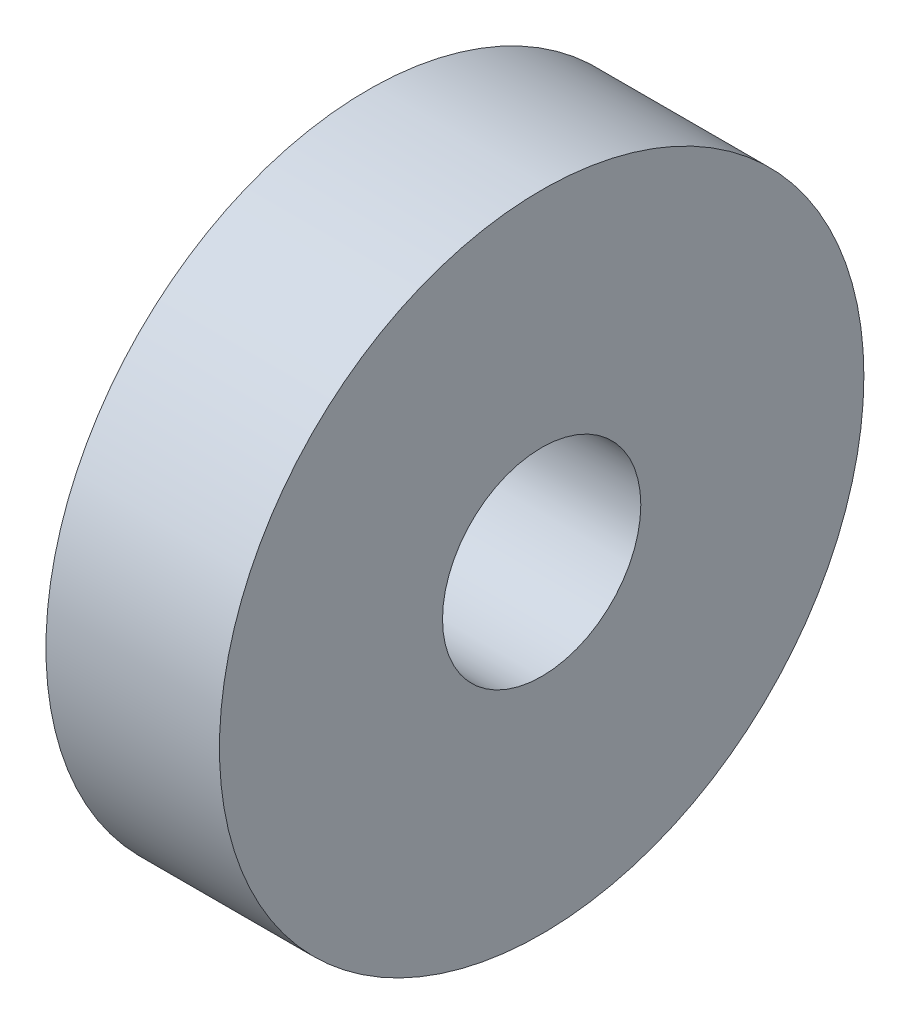
ISO-10303-21;
HEADER;
FILE_DESCRIPTION(('STEP AP214'),'2;1');
FILE_NAME('part.step','',(''),(''),'','','');
FILE_SCHEMA(('AUTOMOTIVE_DESIGN { 1 0 10303 214 1 1 1 1 }'));
ENDSEC;
DATA;
#1=APPLICATION_CONTEXT('core data for automotive mechanical design processes');
#2=APPLICATION_PROTOCOL_DEFINITION('international standard','automotive_design',2000,#1);
#3=PRODUCT_CONTEXT('',#1,'mechanical');
#4=PRODUCT('Part','Part','',(#3));
#5=PRODUCT_RELATED_PRODUCT_CATEGORY('part','',(#4));
#6=PRODUCT_DEFINITION_FORMATION('','',#4);
#7=PRODUCT_DEFINITION_CONTEXT('part definition',#1,'design');
#8=PRODUCT_DEFINITION('design','',#6,#7);
#9=PRODUCT_DEFINITION_SHAPE('','',#8);
#10=(LENGTH_UNIT() NAMED_UNIT(*) SI_UNIT(.MILLI.,.METRE.));
#11=(NAMED_UNIT(*) PLANE_ANGLE_UNIT() SI_UNIT($,.RADIAN.));
#12=(NAMED_UNIT(*) SI_UNIT($,.STERADIAN.) SOLID_ANGLE_UNIT());
#13=UNCERTAINTY_MEASURE_WITH_UNIT(LENGTH_MEASURE(1.E-05),#10,'distance_accuracy_value','');
#14=(GEOMETRIC_REPRESENTATION_CONTEXT(3) GLOBAL_UNCERTAINTY_ASSIGNED_CONTEXT((#13)) GLOBAL_UNIT_ASSIGNED_CONTEXT((#10,
#11,#12)) REPRESENTATION_CONTEXT('',''));
#15=CARTESIAN_POINT('',(0.,0.,0.));
#16=DIRECTION('',(0.,0.,1.));
#17=DIRECTION('',(1.,0.,0.));
#18=AXIS2_PLACEMENT_3D('',#15,#16,#17);
#19=CARTESIAN_POINT('',(-7.,0.,0.));
#20=DIRECTION('',(1.,0.,0.));
#21=DIRECTION('',(0.,0.,-1.));
#22=AXIS2_PLACEMENT_3D('',#19,#20,#21);
#23=CYLINDRICAL_SURFACE('',#22,13.);
#24=CARTESIAN_POINT('',(-7.,0.,0.));
#25=DIRECTION('',(1.,0.,0.));
#26=DIRECTION('',(0.,0.,-1.));
#27=AXIS2_PLACEMENT_3D('',#24,#25,#26);
#28=CIRCLE('',#27,13.);
#29=CARTESIAN_POINT('',(-7.,0.,-13.));
#30=VERTEX_POINT('',#29);
#31=EDGE_CURVE('E10',#30,#30,#28,.T.);
#32=ORIENTED_EDGE('',*,*,#31,.T.);
#33=EDGE_LOOP('',(#32));
#34=FACE_BOUND('',#33,.T.);
#35=CARTESIAN_POINT('',(0.,0.,0.));
#36=DIRECTION('',(1.,0.,0.));
#37=DIRECTION('',(0.,0.,-1.));
#38=AXIS2_PLACEMENT_3D('',#35,#36,#37);
#39=CIRCLE('',#38,13.);
#40=CARTESIAN_POINT('',(0.,0.,-13.));
#41=VERTEX_POINT('',#40);
#42=EDGE_CURVE('E33',#41,#41,#39,.T.);
#43=ORIENTED_EDGE('',*,*,#42,.F.);
#44=EDGE_LOOP('',(#43));
#45=FACE_BOUND('',#44,.T.);
#46=ADVANCED_FACE('F30',(#34,#45),#23,.T.);
#47=CARTESIAN_POINT('',(-7.,0.,0.));
#48=DIRECTION('',(1.,0.,0.));
#49=DIRECTION('',(0.,0.,-1.));
#50=AXIS2_PLACEMENT_3D('',#47,#48,#49);
#51=PLANE('',#50);
#52=CARTESIAN_POINT('',(-7.,0.,0.));
#53=DIRECTION('',(1.,0.,0.));
#54=DIRECTION('',(0.,0.,-1.));
#55=AXIS2_PLACEMENT_3D('',#52,#53,#54);
#56=CIRCLE('',#55,4.);
#57=CARTESIAN_POINT('',(-7.,0.,-4.));
#58=VERTEX_POINT('',#57);
#59=EDGE_CURVE('E40',#58,#58,#56,.T.);
#60=ORIENTED_EDGE('',*,*,#59,.T.);
#61=EDGE_LOOP('',(#60));
#62=FACE_BOUND('',#61,.T.);
#63=ORIENTED_EDGE('',*,*,#31,.F.);
#64=EDGE_LOOP('',(#63));
#65=FACE_BOUND('',#64,.T.);
#66=ADVANCED_FACE('F48',(#62,#65),#51,.F.);
#67=CARTESIAN_POINT('',(0.,0.,0.));
#68=DIRECTION('',(1.,0.,0.));
#69=DIRECTION('',(0.,0.,-1.));
#70=AXIS2_PLACEMENT_3D('',#67,#68,#69);
#71=PLANE('',#70);
#72=CARTESIAN_POINT('',(0.,0.,0.));
#73=DIRECTION('',(1.,0.,0.));
#74=DIRECTION('',(0.,0.,-1.));
#75=AXIS2_PLACEMENT_3D('',#72,#73,#74);
#76=CIRCLE('',#75,4.);
#77=CARTESIAN_POINT('',(0.,0.,-4.));
#78=VERTEX_POINT('',#77);
#79=EDGE_CURVE('E42',#78,#78,#76,.T.);
#80=ORIENTED_EDGE('',*,*,#79,.F.);
#81=EDGE_LOOP('',(#80));
#82=FACE_BOUND('',#81,.T.);
#83=ORIENTED_EDGE('',*,*,#42,.T.);
#84=EDGE_LOOP('',(#83));
#85=FACE_BOUND('',#84,.T.);
#86=ADVANCED_FACE('F54',(#82,#85),#71,.T.);
#87=CARTESIAN_POINT('',(-7.,0.,0.));
#88=DIRECTION('',(1.,0.,0.));
#89=DIRECTION('',(0.,0.,-1.));
#90=AXIS2_PLACEMENT_3D('',#87,#88,#89);
#91=CYLINDRICAL_SURFACE('',#90,4.);
#92=ORIENTED_EDGE('',*,*,#59,.F.);
#93=EDGE_LOOP('',(#92));
#94=FACE_BOUND('',#93,.T.);
#95=ORIENTED_EDGE('',*,*,#79,.T.);
#96=EDGE_LOOP('',(#95));
#97=FACE_BOUND('',#96,.T.);
#98=ADVANCED_FACE('F51',(#94,#97),#91,.F.);
#99=CLOSED_SHELL('',(#46,#66,#86,#98));
#100=MANIFOLD_SOLID_BREP('B2',#99);
#101=ADVANCED_BREP_SHAPE_REPRESENTATION('',(#18,#100),#14);
#102=SHAPE_DEFINITION_REPRESENTATION(#9,#101);
ENDSEC;
END-ISO-10303-21;
